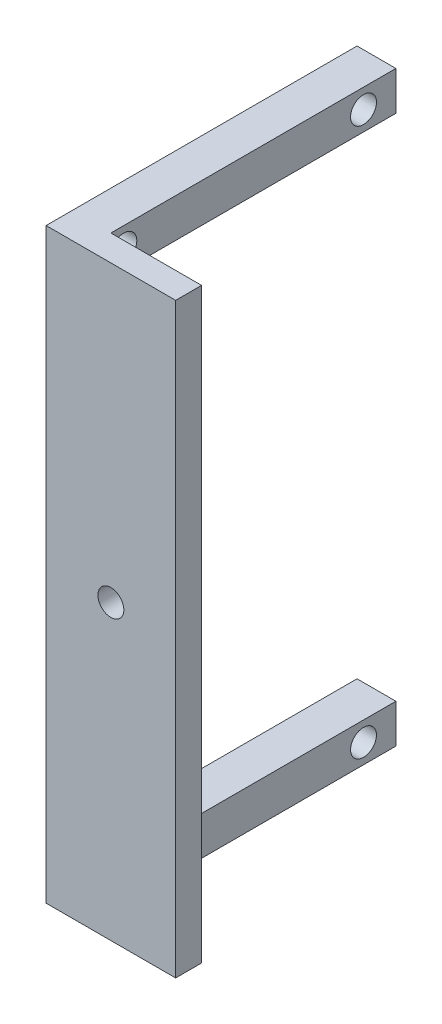
ISO-10303-21;
HEADER;
FILE_DESCRIPTION(('STEP AP214'),'2;1');
FILE_NAME('part.step','',(''),(''),'','','');
FILE_SCHEMA(('AUTOMOTIVE_DESIGN { 1 0 10303 214 1 1 1 1 }'));
ENDSEC;
DATA;
#1=APPLICATION_CONTEXT('core data for automotive mechanical design processes');
#2=APPLICATION_PROTOCOL_DEFINITION('international standard','automotive_design',2000,#1);
#3=PRODUCT_CONTEXT('',#1,'mechanical');
#4=PRODUCT('Part','Part','',(#3));
#5=PRODUCT_RELATED_PRODUCT_CATEGORY('part','',(#4));
#6=PRODUCT_DEFINITION_FORMATION('','',#4);
#7=PRODUCT_DEFINITION_CONTEXT('part definition',#1,'design');
#8=PRODUCT_DEFINITION('design','',#6,#7);
#9=PRODUCT_DEFINITION_SHAPE('','',#8);
#10=(LENGTH_UNIT() NAMED_UNIT(*) SI_UNIT(.MILLI.,.METRE.));
#11=(NAMED_UNIT(*) PLANE_ANGLE_UNIT() SI_UNIT($,.RADIAN.));
#12=(NAMED_UNIT(*) SI_UNIT($,.STERADIAN.) SOLID_ANGLE_UNIT());
#13=UNCERTAINTY_MEASURE_WITH_UNIT(LENGTH_MEASURE(1.E-05),#10,'distance_accuracy_value','');
#14=(GEOMETRIC_REPRESENTATION_CONTEXT(3) GLOBAL_UNCERTAINTY_ASSIGNED_CONTEXT((#13)) GLOBAL_UNIT_ASSIGNED_CONTEXT((#10,
#11,#12)) REPRESENTATION_CONTEXT('',''));
#15=CARTESIAN_POINT('',(0.,0.,0.));
#16=DIRECTION('',(0.,0.,1.));
#17=DIRECTION('',(1.,0.,0.));
#18=AXIS2_PLACEMENT_3D('',#15,#16,#17);
#19=CARTESIAN_POINT('',(0.,0.,0.));
#20=DIRECTION('',(0.,0.,1.));
#21=DIRECTION('',(1.,0.,0.));
#22=AXIS2_PLACEMENT_3D('',#19,#20,#21);
#23=PLANE('',#22);
#24=CARTESIAN_POINT('',(2.5934774136075,6.07301974685423,0.));
#25=DIRECTION('',(0.,0.,-1.));
#26=DIRECTION('',(-1.,0.,0.));
#27=AXIS2_PLACEMENT_3D('',#24,#25,#26);
#28=CIRCLE('',#27,1.);
#29=CARTESIAN_POINT('',(1.5934774136075,6.07301974685423,0.));
#30=VERTEX_POINT('',#29);
#31=EDGE_CURVE('E228',#30,#30,#28,.T.);
#32=ORIENTED_EDGE('',*,*,#31,.F.);
#33=EDGE_LOOP('',(#32));
#34=FACE_BOUND('',#33,.T.);
#35=DIRECTION('',(-1.,0.,0.));
#36=VECTOR('',#35,1.);
#37=CARTESIAN_POINT('',(7.5934774136075,28.7730197468542,0.));
#38=LINE('',#37,#36);
#39=CARTESIAN_POINT('',(7.5934774136075,28.7730197468542,0.));
#40=VERTEX_POINT('',#39);
#41=CARTESIAN_POINT('',(0.593477413607497,28.7730197468542,0.));
#42=VERTEX_POINT('',#41);
#43=EDGE_CURVE('E186',#40,#42,#38,.T.);
#44=ORIENTED_EDGE('',*,*,#43,.F.);
#45=DIRECTION('',(0.,1.,0.));
#46=VECTOR('',#45,1.);
#47=CARTESIAN_POINT('',(7.5934774136075,-16.5269802531458,0.));
#48=LINE('',#47,#46);
#49=CARTESIAN_POINT('',(7.5934774136075,-16.5269802531458,0.));
#50=VERTEX_POINT('',#49);
#51=EDGE_CURVE('E196',#50,#40,#48,.T.);
#52=ORIENTED_EDGE('',*,*,#51,.F.);
#53=DIRECTION('',(1.,0.,0.));
#54=VECTOR('',#53,1.);
#55=CARTESIAN_POINT('',(7.5934774136075,-16.5269802531458,0.));
#56=LINE('',#55,#54);
#57=CARTESIAN_POINT('',(0.593477413607497,-16.5269802531458,0.));
#58=VERTEX_POINT('',#57);
#59=EDGE_CURVE('E194',#58,#50,#56,.T.);
#60=ORIENTED_EDGE('',*,*,#59,.F.);
#61=DIRECTION('',(0.,-1.,0.));
#62=VECTOR('',#61,1.);
#63=CARTESIAN_POINT('',(0.593477413607497,-13.5269802531458,0.));
#64=LINE('',#63,#62);
#65=CARTESIAN_POINT('',(0.593477413607497,-15.0269802531458,0.));
#66=VERTEX_POINT('',#65);
#67=EDGE_CURVE('E144',#66,#58,#64,.T.);
#68=ORIENTED_EDGE('',*,*,#67,.F.);
#69=CARTESIAN_POINT('',(0.593477413607497,-13.5269802531458,0.));
#70=VERTEX_POINT('',#69);
#71=EDGE_CURVE('E132',#70,#66,#64,.T.);
#72=ORIENTED_EDGE('',*,*,#71,.F.);
#73=DIRECTION('',(1.,0.,0.));
#74=VECTOR('',#73,1.);
#75=CARTESIAN_POINT('',(0.593477413607497,-13.5269802531458,0.));
#76=LINE('',#75,#74);
#77=CARTESIAN_POINT('',(-2.4065225863925,-13.5269802531458,0.));
#78=VERTEX_POINT('',#77);
#79=EDGE_CURVE('E121',#78,#70,#76,.T.);
#80=ORIENTED_EDGE('',*,*,#79,.F.);
#81=DIRECTION('',(0.,-1.,0.));
#82=VECTOR('',#81,1.);
#83=CARTESIAN_POINT('',(-2.4065225863925,-16.5269802531458,0.));
#84=LINE('',#83,#82);
#85=CARTESIAN_POINT('',(-2.4065225863925,25.7730197468542,0.));
#86=VERTEX_POINT('',#85);
#87=EDGE_CURVE('E181',#86,#78,#84,.T.);
#88=ORIENTED_EDGE('',*,*,#87,.F.);
#89=DIRECTION('',(-1.,0.,0.));
#90=VECTOR('',#89,1.);
#91=CARTESIAN_POINT('',(0.593477413607496,25.7730197468542,0.));
#92=LINE('',#91,#90);
#93=CARTESIAN_POINT('',(0.593477413607496,25.7730197468542,0.));
#94=VERTEX_POINT('',#93);
#95=EDGE_CURVE('E161',#94,#86,#92,.T.);
#96=ORIENTED_EDGE('',*,*,#95,.F.);
#97=DIRECTION('',(0.,-1.,0.));
#98=VECTOR('',#97,1.);
#99=CARTESIAN_POINT('',(0.593477413607497,28.7730197468542,0.));
#100=LINE('',#99,#98);
#101=CARTESIAN_POINT('',(0.593477413607497,27.2730197468542,0.));
#102=VERTEX_POINT('',#101);
#103=EDGE_CURVE('E131',#102,#94,#100,.T.);
#104=ORIENTED_EDGE('',*,*,#103,.F.);
#105=EDGE_CURVE('E168',#42,#102,#100,.T.);
#106=ORIENTED_EDGE('',*,*,#105,.F.);
#107=EDGE_LOOP('',(#44,#52,#60,#68,#72,#80,#88,#96,#104,#106));
#108=FACE_BOUND('',#107,.T.);
#109=ADVANCED_FACE('F39',(#34,#108),#23,.F.);
#110=CARTESIAN_POINT('',(-2.4065225863925,-16.5269802531458,2.));
#111=DIRECTION('',(1.,0.,0.));
#112=DIRECTION('',(0.,0.,-1.));
#113=AXIS2_PLACEMENT_3D('',#110,#111,#112);
#114=PLANE('',#113);
#115=CARTESIAN_POINT('',(-2.4065225863925,-15.0269802531458,-19.5));
#116=DIRECTION('',(-1.,0.,0.));
#117=DIRECTION('',(0.,0.,1.));
#118=AXIS2_PLACEMENT_3D('',#115,#116,#117);
#119=CIRCLE('',#118,1.);
#120=CARTESIAN_POINT('',(-2.4065225863925,-15.0269802531458,-18.5));
#121=VERTEX_POINT('',#120);
#122=EDGE_CURVE('E220',#121,#121,#119,.T.);
#123=ORIENTED_EDGE('',*,*,#122,.F.);
#124=EDGE_LOOP('',(#123));
#125=FACE_BOUND('',#124,.T.);
#126=CARTESIAN_POINT('',(-2.4065225863925,-15.0269802531458,-1.));
#127=DIRECTION('',(-1.,0.,0.));
#128=DIRECTION('',(0.,0.,1.));
#129=AXIS2_PLACEMENT_3D('',#126,#127,#128);
#130=CIRCLE('',#129,1.);
#131=CARTESIAN_POINT('',(-2.4065225863925,-15.0269802531458,0.));
#132=VERTEX_POINT('',#131);
#133=EDGE_CURVE('E223',#132,#132,#130,.T.);
#134=ORIENTED_EDGE('',*,*,#133,.F.);
#135=EDGE_LOOP('',(#134));
#136=FACE_BOUND('',#135,.T.);
#137=CARTESIAN_POINT('',(-2.4065225863925,27.2730197468542,-1.));
#138=DIRECTION('',(-1.,0.,0.));
#139=DIRECTION('',(0.,0.,1.));
#140=AXIS2_PLACEMENT_3D('',#137,#138,#139);
#141=CIRCLE('',#140,1.);
#142=CARTESIAN_POINT('',(-2.4065225863925,27.2730197468542,0.));
#143=VERTEX_POINT('',#142);
#144=EDGE_CURVE('E219',#143,#143,#141,.T.);
#145=ORIENTED_EDGE('',*,*,#144,.F.);
#146=EDGE_LOOP('',(#145));
#147=FACE_BOUND('',#146,.T.);
#148=CARTESIAN_POINT('',(-2.4065225863925,27.2730197468542,-19.5));
#149=DIRECTION('',(-1.,0.,0.));
#150=DIRECTION('',(0.,0.,1.));
#151=AXIS2_PLACEMENT_3D('',#148,#149,#150);
#152=CIRCLE('',#151,1.);
#153=CARTESIAN_POINT('',(-2.4065225863925,27.2730197468542,-18.5));
#154=VERTEX_POINT('',#153);
#155=EDGE_CURVE('E208',#154,#154,#152,.T.);
#156=ORIENTED_EDGE('',*,*,#155,.F.);
#157=EDGE_LOOP('',(#156));
#158=FACE_BOUND('',#157,.T.);
#159=DIRECTION('',(0.,0.,-1.));
#160=VECTOR('',#159,1.);
#161=CARTESIAN_POINT('',(-2.4065225863925,28.7730197468542,2.));
#162=LINE('',#161,#160);
#163=CARTESIAN_POINT('',(-2.4065225863925,28.7730197468542,2.));
#164=VERTEX_POINT('',#163);
#165=CARTESIAN_POINT('',(-2.4065225863925,28.7730197468542,-22.));
#166=VERTEX_POINT('',#165);
#167=EDGE_CURVE('E192',#164,#166,#162,.T.);
#168=ORIENTED_EDGE('',*,*,#167,.T.);
#169=DIRECTION('',(0.,1.,0.));
#170=VECTOR('',#169,1.);
#171=CARTESIAN_POINT('',(-2.4065225863925,28.7730197468542,-22.));
#172=LINE('',#171,#170);
#173=CARTESIAN_POINT('',(-2.4065225863925,25.7730197468542,-22.));
#174=VERTEX_POINT('',#173);
#175=EDGE_CURVE('E157',#174,#166,#172,.T.);
#176=ORIENTED_EDGE('',*,*,#175,.F.);
#177=DIRECTION('',(0.,0.,1.));
#178=VECTOR('',#177,1.);
#179=CARTESIAN_POINT('',(-2.4065225863925,25.7730197468542,-22.));
#180=LINE('',#179,#178);
#181=EDGE_CURVE('E167',#174,#86,#180,.T.);
#182=ORIENTED_EDGE('',*,*,#181,.T.);
#183=ORIENTED_EDGE('',*,*,#87,.T.);
#184=DIRECTION('',(0.,0.,1.));
#185=VECTOR('',#184,1.);
#186=CARTESIAN_POINT('',(-2.4065225863925,-13.5269802531458,-22.));
#187=LINE('',#186,#185);
#188=CARTESIAN_POINT('',(-2.4065225863925,-13.5269802531458,-22.));
#189=VERTEX_POINT('',#188);
#190=EDGE_CURVE('E127',#189,#78,#187,.T.);
#191=ORIENTED_EDGE('',*,*,#190,.F.);
#192=DIRECTION('',(0.,1.,0.));
#193=VECTOR('',#192,1.);
#194=CARTESIAN_POINT('',(-2.4065225863925,-13.5269802531458,-22.));
#195=LINE('',#194,#193);
#196=CARTESIAN_POINT('',(-2.4065225863925,-16.5269802531458,-22.));
#197=VERTEX_POINT('',#196);
#198=EDGE_CURVE('E146',#197,#189,#195,.T.);
#199=ORIENTED_EDGE('',*,*,#198,.F.);
#200=DIRECTION('',(0.,0.,-1.));
#201=VECTOR('',#200,1.);
#202=CARTESIAN_POINT('',(-2.4065225863925,-16.5269802531458,2.));
#203=LINE('',#202,#201);
#204=CARTESIAN_POINT('',(-2.4065225863925,-16.5269802531458,2.));
#205=VERTEX_POINT('',#204);
#206=EDGE_CURVE('E11',#205,#197,#203,.T.);
#207=ORIENTED_EDGE('',*,*,#206,.F.);
#208=DIRECTION('',(0.,-1.,0.));
#209=VECTOR('',#208,1.);
#210=CARTESIAN_POINT('',(-2.4065225863925,-16.5269802531458,2.));
#211=LINE('',#210,#209);
#212=EDGE_CURVE('E182',#164,#205,#211,.T.);
#213=ORIENTED_EDGE('',*,*,#212,.F.);
#214=EDGE_LOOP('',(#168,#176,#182,#183,#191,#199,#207,#213));
#215=FACE_BOUND('',#214,.T.);
#216=ADVANCED_FACE('F41',(#125,#136,#147,#158,#215),#114,.F.);
#217=CARTESIAN_POINT('',(7.5934774136075,-16.5269802531458,2.));
#218=DIRECTION('',(0.,1.,0.));
#219=DIRECTION('',(0.,0.,1.));
#220=AXIS2_PLACEMENT_3D('',#217,#218,#219);
#221=PLANE('',#220);
#222=ORIENTED_EDGE('',*,*,#206,.T.);
#223=DIRECTION('',(-1.,0.,0.));
#224=VECTOR('',#223,1.);
#225=CARTESIAN_POINT('',(0.593477413607496,-16.5269802531458,-22.));
#226=LINE('',#225,#224);
#227=CARTESIAN_POINT('',(0.593477413607496,-16.5269802531458,-22.));
#228=VERTEX_POINT('',#227);
#229=EDGE_CURVE('E149',#228,#197,#226,.T.);
#230=ORIENTED_EDGE('',*,*,#229,.F.);
#231=DIRECTION('',(0.,0.,1.));
#232=VECTOR('',#231,1.);
#233=CARTESIAN_POINT('',(0.593477413607496,-16.5269802531458,-22.));
#234=LINE('',#233,#232);
#235=EDGE_CURVE('E139',#228,#58,#234,.T.);
#236=ORIENTED_EDGE('',*,*,#235,.T.);
#237=ORIENTED_EDGE('',*,*,#59,.T.);
#238=DIRECTION('',(0.,0.,-1.));
#239=VECTOR('',#238,1.);
#240=CARTESIAN_POINT('',(7.5934774136075,-16.5269802531458,2.));
#241=LINE('',#240,#239);
#242=CARTESIAN_POINT('',(7.5934774136075,-16.5269802531458,2.));
#243=VERTEX_POINT('',#242);
#244=EDGE_CURVE('E48',#243,#50,#241,.T.);
#245=ORIENTED_EDGE('',*,*,#244,.F.);
#246=DIRECTION('',(1.,0.,0.));
#247=VECTOR('',#246,1.);
#248=CARTESIAN_POINT('',(7.5934774136075,-16.5269802531458,2.));
#249=LINE('',#248,#247);
#250=EDGE_CURVE('E185',#205,#243,#249,.T.);
#251=ORIENTED_EDGE('',*,*,#250,.F.);
#252=EDGE_LOOP('',(#222,#230,#236,#237,#245,#251));
#253=FACE_BOUND('',#252,.T.);
#254=ADVANCED_FACE('F252',(#253),#221,.F.);
#255=CARTESIAN_POINT('',(7.5934774136075,-16.5269802531458,2.));
#256=DIRECTION('',(-1.,0.,0.));
#257=DIRECTION('',(0.,0.,1.));
#258=AXIS2_PLACEMENT_3D('',#255,#256,#257);
#259=PLANE('',#258);
#260=ORIENTED_EDGE('',*,*,#51,.T.);
#261=DIRECTION('',(0.,0.,-1.));
#262=VECTOR('',#261,1.);
#263=CARTESIAN_POINT('',(7.5934774136075,28.7730197468542,2.));
#264=LINE('',#263,#262);
#265=CARTESIAN_POINT('',(7.5934774136075,28.7730197468542,2.));
#266=VERTEX_POINT('',#265);
#267=EDGE_CURVE('E201',#266,#40,#264,.T.);
#268=ORIENTED_EDGE('',*,*,#267,.F.);
#269=DIRECTION('',(0.,1.,0.));
#270=VECTOR('',#269,1.);
#271=CARTESIAN_POINT('',(7.5934774136075,-16.5269802531458,2.));
#272=LINE('',#271,#270);
#273=EDGE_CURVE('E188',#243,#266,#272,.T.);
#274=ORIENTED_EDGE('',*,*,#273,.F.);
#275=ORIENTED_EDGE('',*,*,#244,.T.);
#276=EDGE_LOOP('',(#260,#268,#274,#275));
#277=FACE_BOUND('',#276,.T.);
#278=ADVANCED_FACE('F259',(#277),#259,.F.);
#279=CARTESIAN_POINT('',(7.5934774136075,28.7730197468542,2.));
#280=DIRECTION('',(0.,-1.,0.));
#281=DIRECTION('',(0.,0.,-1.));
#282=AXIS2_PLACEMENT_3D('',#279,#280,#281);
#283=PLANE('',#282);
#284=ORIENTED_EDGE('',*,*,#43,.T.);
#285=DIRECTION('',(0.,0.,1.));
#286=VECTOR('',#285,1.);
#287=CARTESIAN_POINT('',(0.593477413607497,28.7730197468542,-22.));
#288=LINE('',#287,#286);
#289=CARTESIAN_POINT('',(0.593477413607497,28.7730197468542,-22.));
#290=VERTEX_POINT('',#289);
#291=EDGE_CURVE('E178',#290,#42,#288,.T.);
#292=ORIENTED_EDGE('',*,*,#291,.F.);
#293=DIRECTION('',(1.,0.,0.));
#294=VECTOR('',#293,1.);
#295=CARTESIAN_POINT('',(0.593477413607497,28.7730197468542,-22.));
#296=LINE('',#295,#294);
#297=EDGE_CURVE('E160',#166,#290,#296,.T.);
#298=ORIENTED_EDGE('',*,*,#297,.F.);
#299=ORIENTED_EDGE('',*,*,#167,.F.);
#300=DIRECTION('',(-1.,0.,0.));
#301=VECTOR('',#300,1.);
#302=CARTESIAN_POINT('',(7.5934774136075,28.7730197468542,2.));
#303=LINE('',#302,#301);
#304=EDGE_CURVE('E190',#266,#164,#303,.T.);
#305=ORIENTED_EDGE('',*,*,#304,.F.);
#306=ORIENTED_EDGE('',*,*,#267,.T.);
#307=EDGE_LOOP('',(#284,#292,#298,#299,#305,#306));
#308=FACE_BOUND('',#307,.T.);
#309=ADVANCED_FACE('F241',(#308),#283,.F.);
#310=CARTESIAN_POINT('',(0.,0.,2.));
#311=DIRECTION('',(0.,0.,1.));
#312=DIRECTION('',(1.,0.,0.));
#313=AXIS2_PLACEMENT_3D('',#310,#311,#312);
#314=PLANE('',#313);
#315=CARTESIAN_POINT('',(2.5934774136075,6.07301974685423,2.));
#316=DIRECTION('',(0.,0.,1.));
#317=DIRECTION('',(1.,0.,0.));
#318=AXIS2_PLACEMENT_3D('',#315,#316,#317);
#319=CIRCLE('',#318,1.);
#320=CARTESIAN_POINT('',(3.5934774136075,6.07301974685423,2.));
#321=VERTEX_POINT('',#320);
#322=EDGE_CURVE('E43',#321,#321,#319,.T.);
#323=ORIENTED_EDGE('',*,*,#322,.F.);
#324=EDGE_LOOP('',(#323));
#325=FACE_BOUND('',#324,.T.);
#326=ORIENTED_EDGE('',*,*,#212,.T.);
#327=ORIENTED_EDGE('',*,*,#250,.T.);
#328=ORIENTED_EDGE('',*,*,#273,.T.);
#329=ORIENTED_EDGE('',*,*,#304,.T.);
#330=EDGE_LOOP('',(#326,#327,#328,#329));
#331=FACE_BOUND('',#330,.T.);
#332=ADVANCED_FACE('F237',(#325,#331),#314,.T.);
#333=CARTESIAN_POINT('',(0.593477413607497,28.7730197468542,-22.));
#334=DIRECTION('',(-1.,0.,0.));
#335=DIRECTION('',(0.,-1.,0.));
#336=AXIS2_PLACEMENT_3D('',#333,#334,#335);
#337=PLANE('',#336);
#338=CARTESIAN_POINT('',(0.593477413607497,27.2730197468542,-19.5));
#339=DIRECTION('',(-1.,0.,0.));
#340=DIRECTION('',(0.,-1.,0.));
#341=AXIS2_PLACEMENT_3D('',#338,#339,#340);
#342=CIRCLE('',#341,1.);
#343=CARTESIAN_POINT('',(0.593477413607497,26.2730197468542,-19.5));
#344=VERTEX_POINT('',#343);
#345=EDGE_CURVE('E211',#344,#344,#342,.T.);
#346=ORIENTED_EDGE('',*,*,#345,.T.);
#347=EDGE_LOOP('',(#346));
#348=FACE_BOUND('',#347,.T.);
#349=ORIENTED_EDGE('',*,*,#105,.T.);
#350=CARTESIAN_POINT('',(0.593477413607497,27.2730197468542,-1.));
#351=DIRECTION('',(-1.,0.,0.));
#352=DIRECTION('',(0.,-1.,0.));
#353=AXIS2_PLACEMENT_3D('',#350,#351,#352);
#354=CIRCLE('',#353,1.);
#355=EDGE_CURVE('E54',#102,#102,#354,.T.);
#356=ORIENTED_EDGE('',*,*,#355,.T.);
#357=ORIENTED_EDGE('',*,*,#103,.T.);
#358=DIRECTION('',(0.,0.,1.));
#359=VECTOR('',#358,1.);
#360=CARTESIAN_POINT('',(0.593477413607496,25.7730197468542,-22.));
#361=LINE('',#360,#359);
#362=CARTESIAN_POINT('',(0.593477413607496,25.7730197468542,-22.));
#363=VERTEX_POINT('',#362);
#364=EDGE_CURVE('E175',#363,#94,#361,.T.);
#365=ORIENTED_EDGE('',*,*,#364,.F.);
#366=DIRECTION('',(0.,-1.,0.));
#367=VECTOR('',#366,1.);
#368=CARTESIAN_POINT('',(0.593477413607497,28.7730197468542,-22.));
#369=LINE('',#368,#367);
#370=EDGE_CURVE('E163',#290,#363,#369,.T.);
#371=ORIENTED_EDGE('',*,*,#370,.F.);
#372=ORIENTED_EDGE('',*,*,#291,.T.);
#373=EDGE_LOOP('',(#349,#356,#357,#365,#371,#372));
#374=FACE_BOUND('',#373,.T.);
#375=ADVANCED_FACE('F240',(#348,#374),#337,.F.);
#376=CARTESIAN_POINT('',(0.593477413607496,25.7730197468542,-22.));
#377=DIRECTION('',(0.,1.,0.));
#378=DIRECTION('',(0.,0.,1.));
#379=AXIS2_PLACEMENT_3D('',#376,#377,#378);
#380=PLANE('',#379);
#381=ORIENTED_EDGE('',*,*,#95,.T.);
#382=ORIENTED_EDGE('',*,*,#181,.F.);
#383=DIRECTION('',(-1.,0.,0.));
#384=VECTOR('',#383,1.);
#385=CARTESIAN_POINT('',(0.593477413607496,25.7730197468542,-22.));
#386=LINE('',#385,#384);
#387=EDGE_CURVE('E165',#363,#174,#386,.T.);
#388=ORIENTED_EDGE('',*,*,#387,.F.);
#389=ORIENTED_EDGE('',*,*,#364,.T.);
#390=EDGE_LOOP('',(#381,#382,#388,#389));
#391=FACE_BOUND('',#390,.T.);
#392=ADVANCED_FACE('F272',(#391),#380,.F.);
#393=CARTESIAN_POINT('',(0.,0.,-22.));
#394=DIRECTION('',(0.,0.,-1.));
#395=DIRECTION('',(-1.,0.,0.));
#396=AXIS2_PLACEMENT_3D('',#393,#394,#395);
#397=PLANE('',#396);
#398=ORIENTED_EDGE('',*,*,#175,.T.);
#399=ORIENTED_EDGE('',*,*,#297,.T.);
#400=ORIENTED_EDGE('',*,*,#370,.T.);
#401=ORIENTED_EDGE('',*,*,#387,.T.);
#402=EDGE_LOOP('',(#398,#399,#400,#401));
#403=FACE_BOUND('',#402,.T.);
#404=ADVANCED_FACE('F267',(#403),#397,.T.);
#405=CARTESIAN_POINT('',(0.593477413607497,-13.5269802531458,-22.));
#406=DIRECTION('',(0.,-1.,0.));
#407=DIRECTION('',(0.,0.,-1.));
#408=AXIS2_PLACEMENT_3D('',#405,#406,#407);
#409=PLANE('',#408);
#410=ORIENTED_EDGE('',*,*,#79,.T.);
#411=DIRECTION('',(0.,0.,1.));
#412=VECTOR('',#411,1.);
#413=CARTESIAN_POINT('',(0.593477413607497,-13.5269802531458,-22.));
#414=LINE('',#413,#412);
#415=CARTESIAN_POINT('',(0.593477413607497,-13.5269802531458,-22.));
#416=VERTEX_POINT('',#415);
#417=EDGE_CURVE('E124',#416,#70,#414,.T.);
#418=ORIENTED_EDGE('',*,*,#417,.F.);
#419=DIRECTION('',(1.,0.,0.));
#420=VECTOR('',#419,1.);
#421=CARTESIAN_POINT('',(0.593477413607497,-13.5269802531458,-22.));
#422=LINE('',#421,#420);
#423=EDGE_CURVE('E153',#189,#416,#422,.T.);
#424=ORIENTED_EDGE('',*,*,#423,.F.);
#425=ORIENTED_EDGE('',*,*,#190,.T.);
#426=EDGE_LOOP('',(#410,#418,#424,#425));
#427=FACE_BOUND('',#426,.T.);
#428=ADVANCED_FACE('F123',(#427),#409,.F.);
#429=CARTESIAN_POINT('',(0.593477413607497,-13.5269802531458,-22.));
#430=DIRECTION('',(-1.,0.,0.));
#431=DIRECTION('',(0.,-1.,0.));
#432=AXIS2_PLACEMENT_3D('',#429,#430,#431);
#433=PLANE('',#432);
#434=CARTESIAN_POINT('',(0.593477413607497,-15.0269802531458,-19.5));
#435=DIRECTION('',(-1.,0.,0.));
#436=DIRECTION('',(0.,-1.,0.));
#437=AXIS2_PLACEMENT_3D('',#434,#435,#436);
#438=CIRCLE('',#437,1.);
#439=CARTESIAN_POINT('',(0.593477413607497,-16.0269802531458,-19.5));
#440=VERTEX_POINT('',#439);
#441=EDGE_CURVE('E207',#440,#440,#438,.T.);
#442=ORIENTED_EDGE('',*,*,#441,.T.);
#443=EDGE_LOOP('',(#442));
#444=FACE_BOUND('',#443,.T.);
#445=ORIENTED_EDGE('',*,*,#71,.T.);
#446=CARTESIAN_POINT('',(0.593477413607497,-15.0269802531458,-1.));
#447=DIRECTION('',(-1.,0.,0.));
#448=DIRECTION('',(0.,-1.,0.));
#449=AXIS2_PLACEMENT_3D('',#446,#447,#448);
#450=CIRCLE('',#449,1.);
#451=EDGE_CURVE('E59',#66,#66,#450,.T.);
#452=ORIENTED_EDGE('',*,*,#451,.T.);
#453=ORIENTED_EDGE('',*,*,#67,.T.);
#454=ORIENTED_EDGE('',*,*,#235,.F.);
#455=DIRECTION('',(0.,-1.,0.));
#456=VECTOR('',#455,1.);
#457=CARTESIAN_POINT('',(0.593477413607497,-13.5269802531458,-22.));
#458=LINE('',#457,#456);
#459=EDGE_CURVE('E138',#416,#228,#458,.T.);
#460=ORIENTED_EDGE('',*,*,#459,.F.);
#461=ORIENTED_EDGE('',*,*,#417,.T.);
#462=EDGE_LOOP('',(#445,#452,#453,#454,#460,#461));
#463=FACE_BOUND('',#462,.T.);
#464=ADVANCED_FACE('F136',(#444,#463),#433,.F.);
#465=CARTESIAN_POINT('',(0.,0.,-22.));
#466=DIRECTION('',(0.,0.,-1.));
#467=DIRECTION('',(-1.,0.,0.));
#468=AXIS2_PLACEMENT_3D('',#465,#466,#467);
#469=PLANE('',#468);
#470=ORIENTED_EDGE('',*,*,#198,.T.);
#471=ORIENTED_EDGE('',*,*,#423,.T.);
#472=ORIENTED_EDGE('',*,*,#459,.T.);
#473=ORIENTED_EDGE('',*,*,#229,.T.);
#474=EDGE_LOOP('',(#470,#471,#472,#473));
#475=FACE_BOUND('',#474,.T.);
#476=ADVANCED_FACE('F255',(#475),#469,.T.);
#477=CARTESIAN_POINT('',(19.5934774136075,-15.0269802531458,-1.));
#478=DIRECTION('',(-1.,0.,0.));
#479=DIRECTION('',(0.,0.,1.));
#480=AXIS2_PLACEMENT_3D('',#477,#478,#479);
#481=CYLINDRICAL_SURFACE('',#480,1.);
#482=ORIENTED_EDGE('',*,*,#133,.T.);
#483=EDGE_LOOP('',(#482));
#484=FACE_BOUND('',#483,.T.);
#485=ORIENTED_EDGE('',*,*,#451,.F.);
#486=EDGE_LOOP('',(#485));
#487=FACE_BOUND('',#486,.T.);
#488=ADVANCED_FACE('F329',(#484,#487),#481,.F.);
#489=CARTESIAN_POINT('',(19.5934774136075,-15.0269802531458,-19.5));
#490=DIRECTION('',(-1.,0.,0.));
#491=DIRECTION('',(0.,0.,1.));
#492=AXIS2_PLACEMENT_3D('',#489,#490,#491);
#493=CYLINDRICAL_SURFACE('',#492,1.);
#494=ORIENTED_EDGE('',*,*,#122,.T.);
#495=EDGE_LOOP('',(#494));
#496=FACE_BOUND('',#495,.T.);
#497=ORIENTED_EDGE('',*,*,#441,.F.);
#498=EDGE_LOOP('',(#497));
#499=FACE_BOUND('',#498,.T.);
#500=ADVANCED_FACE('F389',(#496,#499),#493,.F.);
#501=CARTESIAN_POINT('',(19.5934774136075,27.2730197468542,-19.5));
#502=DIRECTION('',(-1.,0.,0.));
#503=DIRECTION('',(0.,0.,1.));
#504=AXIS2_PLACEMENT_3D('',#501,#502,#503);
#505=CYLINDRICAL_SURFACE('',#504,1.);
#506=ORIENTED_EDGE('',*,*,#155,.T.);
#507=EDGE_LOOP('',(#506));
#508=FACE_BOUND('',#507,.T.);
#509=ORIENTED_EDGE('',*,*,#345,.F.);
#510=EDGE_LOOP('',(#509));
#511=FACE_BOUND('',#510,.T.);
#512=ADVANCED_FACE('F398',(#508,#511),#505,.F.);
#513=CARTESIAN_POINT('',(19.5934774136075,27.2730197468542,-1.));
#514=DIRECTION('',(-1.,0.,0.));
#515=DIRECTION('',(0.,0.,1.));
#516=AXIS2_PLACEMENT_3D('',#513,#514,#515);
#517=CYLINDRICAL_SURFACE('',#516,1.);
#518=ORIENTED_EDGE('',*,*,#144,.T.);
#519=EDGE_LOOP('',(#518));
#520=FACE_BOUND('',#519,.T.);
#521=ORIENTED_EDGE('',*,*,#355,.F.);
#522=EDGE_LOOP('',(#521));
#523=FACE_BOUND('',#522,.T.);
#524=ADVANCED_FACE('F407',(#520,#523),#517,.F.);
#525=CARTESIAN_POINT('',(2.5934774136075,6.07301974685423,22.));
#526=DIRECTION('',(0.,0.,-1.));
#527=DIRECTION('',(-1.,0.,0.));
#528=AXIS2_PLACEMENT_3D('',#525,#526,#527);
#529=CYLINDRICAL_SURFACE('',#528,1.);
#530=ORIENTED_EDGE('',*,*,#322,.T.);
#531=EDGE_LOOP('',(#530));
#532=FACE_BOUND('',#531,.T.);
#533=ORIENTED_EDGE('',*,*,#31,.T.);
#534=EDGE_LOOP('',(#533));
#535=FACE_BOUND('',#534,.T.);
#536=ADVANCED_FACE('F235',(#532,#535),#529,.F.);
#537=CLOSED_SHELL('',(#109,#216,#254,#278,#309,#332,#375,#392,#404,#428,#464,#476,#488,#500,
#512,#524,#536));
#538=MANIFOLD_SOLID_BREP('B2',#537);
#539=ADVANCED_BREP_SHAPE_REPRESENTATION('',(#18,#538),#14);
#540=SHAPE_DEFINITION_REPRESENTATION(#9,#539);
ENDSEC;
END-ISO-10303-21;
